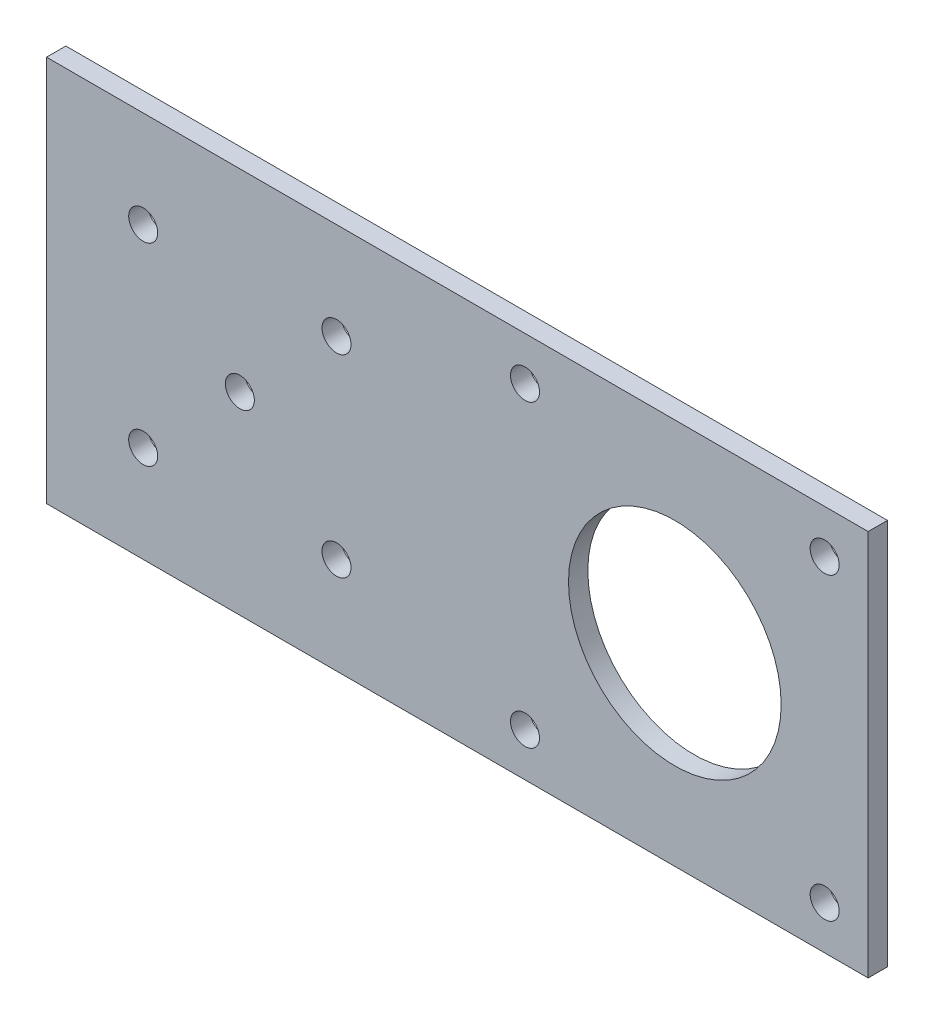
ISO-10303-21;
HEADER;
FILE_DESCRIPTION(('STEP AP214'),'2;1');
FILE_NAME('part.step','',(''),(''),'','','');
FILE_SCHEMA(('AUTOMOTIVE_DESIGN { 1 0 10303 214 1 1 1 1 }'));
ENDSEC;
DATA;
#1=APPLICATION_CONTEXT('core data for automotive mechanical design processes');
#2=APPLICATION_PROTOCOL_DEFINITION('international standard','automotive_design',2000,#1);
#3=PRODUCT_CONTEXT('',#1,'mechanical');
#4=PRODUCT('Part','Part','',(#3));
#5=PRODUCT_RELATED_PRODUCT_CATEGORY('part','',(#4));
#6=PRODUCT_DEFINITION_FORMATION('','',#4);
#7=PRODUCT_DEFINITION_CONTEXT('part definition',#1,'design');
#8=PRODUCT_DEFINITION('design','',#6,#7);
#9=PRODUCT_DEFINITION_SHAPE('','',#8);
#10=(LENGTH_UNIT() NAMED_UNIT(*) SI_UNIT(.MILLI.,.METRE.));
#11=(NAMED_UNIT(*) PLANE_ANGLE_UNIT() SI_UNIT($,.RADIAN.));
#12=(NAMED_UNIT(*) SI_UNIT($,.STERADIAN.) SOLID_ANGLE_UNIT());
#13=UNCERTAINTY_MEASURE_WITH_UNIT(LENGTH_MEASURE(1.E-05),#10,'distance_accuracy_value','');
#14=(GEOMETRIC_REPRESENTATION_CONTEXT(3) GLOBAL_UNCERTAINTY_ASSIGNED_CONTEXT((#13)) GLOBAL_UNIT_ASSIGNED_CONTEXT((#10,
#11,#12)) REPRESENTATION_CONTEXT('',''));
#15=CARTESIAN_POINT('',(0.,0.,0.));
#16=DIRECTION('',(0.,0.,1.));
#17=DIRECTION('',(1.,0.,0.));
#18=AXIS2_PLACEMENT_3D('',#15,#16,#17);
#19=CARTESIAN_POINT('',(42.5,20.,1.));
#20=DIRECTION('',(-1.,0.,0.));
#21=DIRECTION('',(0.,-1.,0.));
#22=AXIS2_PLACEMENT_3D('',#19,#20,#21);
#23=PLANE('',#22);
#24=DIRECTION('',(0.,1.,0.));
#25=VECTOR('',#24,1.);
#26=CARTESIAN_POINT('',(42.5,20.,-1.));
#27=LINE('',#26,#25);
#28=CARTESIAN_POINT('',(42.5,-20.,-1.));
#29=VERTEX_POINT('',#28);
#30=CARTESIAN_POINT('',(42.5,20.,-1.));
#31=VERTEX_POINT('',#30);
#32=EDGE_CURVE('E104',#29,#31,#27,.T.);
#33=ORIENTED_EDGE('',*,*,#32,.T.);
#34=DIRECTION('',(0.,0.,-1.));
#35=VECTOR('',#34,1.);
#36=CARTESIAN_POINT('',(42.5,20.,1.));
#37=LINE('',#36,#35);
#38=CARTESIAN_POINT('',(42.5,20.,1.));
#39=VERTEX_POINT('',#38);
#40=EDGE_CURVE('E11',#39,#31,#37,.T.);
#41=ORIENTED_EDGE('',*,*,#40,.F.);
#42=DIRECTION('',(0.,1.,0.));
#43=VECTOR('',#42,1.);
#44=CARTESIAN_POINT('',(42.5,20.,1.));
#45=LINE('',#44,#43);
#46=CARTESIAN_POINT('',(42.5,-20.,1.));
#47=VERTEX_POINT('',#46);
#48=EDGE_CURVE('E91',#47,#39,#45,.T.);
#49=ORIENTED_EDGE('',*,*,#48,.F.);
#50=DIRECTION('',(0.,0.,-1.));
#51=VECTOR('',#50,1.);
#52=CARTESIAN_POINT('',(42.5,-20.,1.));
#53=LINE('',#52,#51);
#54=EDGE_CURVE('E100',#47,#29,#53,.T.);
#55=ORIENTED_EDGE('',*,*,#54,.T.);
#56=EDGE_LOOP('',(#33,#41,#49,#55));
#57=FACE_BOUND('',#56,.T.);
#58=ADVANCED_FACE('F38',(#57),#23,.F.);
#59=CARTESIAN_POINT('',(-42.5,20.,1.));
#60=DIRECTION('',(0.,-1.,0.));
#61=DIRECTION('',(0.,0.,-1.));
#62=AXIS2_PLACEMENT_3D('',#59,#60,#61);
#63=PLANE('',#62);
#64=DIRECTION('',(-1.,0.,0.));
#65=VECTOR('',#64,1.);
#66=CARTESIAN_POINT('',(-42.5,20.,-1.));
#67=LINE('',#66,#65);
#68=CARTESIAN_POINT('',(-42.5,20.,-1.));
#69=VERTEX_POINT('',#68);
#70=EDGE_CURVE('E95',#31,#69,#67,.T.);
#71=ORIENTED_EDGE('',*,*,#70,.T.);
#72=DIRECTION('',(0.,0.,-1.));
#73=VECTOR('',#72,1.);
#74=CARTESIAN_POINT('',(-42.5,20.,1.));
#75=LINE('',#74,#73);
#76=CARTESIAN_POINT('',(-42.5,20.,1.));
#77=VERTEX_POINT('',#76);
#78=EDGE_CURVE('E47',#77,#69,#75,.T.);
#79=ORIENTED_EDGE('',*,*,#78,.F.);
#80=DIRECTION('',(-1.,0.,0.));
#81=VECTOR('',#80,1.);
#82=CARTESIAN_POINT('',(-42.5,20.,1.));
#83=LINE('',#82,#81);
#84=EDGE_CURVE('E86',#39,#77,#83,.T.);
#85=ORIENTED_EDGE('',*,*,#84,.F.);
#86=ORIENTED_EDGE('',*,*,#40,.T.);
#87=EDGE_LOOP('',(#71,#79,#85,#86));
#88=FACE_BOUND('',#87,.T.);
#89=ADVANCED_FACE('F94',(#88),#63,.F.);
#90=CARTESIAN_POINT('',(-42.5,20.,1.));
#91=DIRECTION('',(1.,0.,0.));
#92=DIRECTION('',(0.,0.,-1.));
#93=AXIS2_PLACEMENT_3D('',#90,#91,#92);
#94=PLANE('',#93);
#95=DIRECTION('',(0.,-1.,0.));
#96=VECTOR('',#95,1.);
#97=CARTESIAN_POINT('',(-42.5,20.,-1.));
#98=LINE('',#97,#96);
#99=CARTESIAN_POINT('',(-42.5,-20.,-1.));
#100=VERTEX_POINT('',#99);
#101=EDGE_CURVE('E73',#69,#100,#98,.T.);
#102=ORIENTED_EDGE('',*,*,#101,.T.);
#103=DIRECTION('',(0.,0.,-1.));
#104=VECTOR('',#103,1.);
#105=CARTESIAN_POINT('',(-42.5,-20.,1.));
#106=LINE('',#105,#104);
#107=CARTESIAN_POINT('',(-42.5,-20.,1.));
#108=VERTEX_POINT('',#107);
#109=EDGE_CURVE('E96',#108,#100,#106,.T.);
#110=ORIENTED_EDGE('',*,*,#109,.F.);
#111=DIRECTION('',(0.,-1.,0.));
#112=VECTOR('',#111,1.);
#113=CARTESIAN_POINT('',(-42.5,20.,1.));
#114=LINE('',#113,#112);
#115=EDGE_CURVE('E89',#77,#108,#114,.T.);
#116=ORIENTED_EDGE('',*,*,#115,.F.);
#117=ORIENTED_EDGE('',*,*,#78,.T.);
#118=EDGE_LOOP('',(#102,#110,#116,#117));
#119=FACE_BOUND('',#118,.T.);
#120=ADVANCED_FACE('F98',(#119),#94,.F.);
#121=CARTESIAN_POINT('',(-42.5,-20.,1.));
#122=DIRECTION('',(0.,1.,0.));
#123=DIRECTION('',(0.,0.,1.));
#124=AXIS2_PLACEMENT_3D('',#121,#122,#123);
#125=PLANE('',#124);
#126=DIRECTION('',(1.,0.,0.));
#127=VECTOR('',#126,1.);
#128=CARTESIAN_POINT('',(-42.5,-20.,-1.));
#129=LINE('',#128,#127);
#130=EDGE_CURVE('E79',#100,#29,#129,.T.);
#131=ORIENTED_EDGE('',*,*,#130,.T.);
#132=ORIENTED_EDGE('',*,*,#54,.F.);
#133=DIRECTION('',(1.,0.,0.));
#134=VECTOR('',#133,1.);
#135=CARTESIAN_POINT('',(-42.5,-20.,1.));
#136=LINE('',#135,#134);
#137=EDGE_CURVE('E56',#108,#47,#136,.T.);
#138=ORIENTED_EDGE('',*,*,#137,.F.);
#139=ORIENTED_EDGE('',*,*,#109,.T.);
#140=EDGE_LOOP('',(#131,#132,#138,#139));
#141=FACE_BOUND('',#140,.T.);
#142=ADVANCED_FACE('F167',(#141),#125,.F.);
#143=CARTESIAN_POINT('',(0.,0.,1.));
#144=DIRECTION('',(0.,0.,1.));
#145=DIRECTION('',(1.,0.,0.));
#146=AXIS2_PLACEMENT_3D('',#143,#144,#145);
#147=PLANE('',#146);
#148=CARTESIAN_POINT('',(7.00000000000032,-15.5,1.));
#149=DIRECTION('',(0.,0.,1.));
#150=DIRECTION('',(1.,0.,0.));
#151=AXIS2_PLACEMENT_3D('',#148,#149,#150);
#152=CIRCLE('',#151,1.5);
#153=CARTESIAN_POINT('',(8.50000000000033,-15.5,1.));
#154=VERTEX_POINT('',#153);
#155=EDGE_CURVE('E333',#154,#154,#152,.T.);
#156=ORIENTED_EDGE('',*,*,#155,.F.);
#157=EDGE_LOOP('',(#156));
#158=FACE_BOUND('',#157,.T.);
#159=CARTESIAN_POINT('',(38.0000000000003,-15.5,1.));
#160=DIRECTION('',(0.,0.,1.));
#161=DIRECTION('',(1.,0.,0.));
#162=AXIS2_PLACEMENT_3D('',#159,#160,#161);
#163=CIRCLE('',#162,1.5);
#164=CARTESIAN_POINT('',(39.5000000000003,-15.5,1.));
#165=VERTEX_POINT('',#164);
#166=EDGE_CURVE('E334',#165,#165,#163,.T.);
#167=ORIENTED_EDGE('',*,*,#166,.F.);
#168=EDGE_LOOP('',(#167));
#169=FACE_BOUND('',#168,.T.);
#170=CARTESIAN_POINT('',(38.,15.5,1.));
#171=DIRECTION('',(0.,0.,1.));
#172=DIRECTION('',(1.,0.,0.));
#173=AXIS2_PLACEMENT_3D('',#170,#171,#172);
#174=CIRCLE('',#173,1.5);
#175=CARTESIAN_POINT('',(39.5,15.5,1.));
#176=VERTEX_POINT('',#175);
#177=EDGE_CURVE('E337',#176,#176,#174,.T.);
#178=ORIENTED_EDGE('',*,*,#177,.F.);
#179=EDGE_LOOP('',(#178));
#180=FACE_BOUND('',#179,.T.);
#181=CARTESIAN_POINT('',(7.,15.5,1.));
#182=DIRECTION('',(0.,0.,1.));
#183=DIRECTION('',(1.,0.,0.));
#184=AXIS2_PLACEMENT_3D('',#181,#182,#183);
#185=CIRCLE('',#184,1.5);
#186=CARTESIAN_POINT('',(8.5,15.5,1.));
#187=VERTEX_POINT('',#186);
#188=EDGE_CURVE('E117',#187,#187,#185,.T.);
#189=ORIENTED_EDGE('',*,*,#188,.F.);
#190=EDGE_LOOP('',(#189));
#191=FACE_BOUND('',#190,.T.);
#192=CARTESIAN_POINT('',(22.5,0.,1.));
#193=DIRECTION('',(0.,0.,1.));
#194=DIRECTION('',(1.,0.,0.));
#195=AXIS2_PLACEMENT_3D('',#192,#193,#194);
#196=CIRCLE('',#195,11.);
#197=CARTESIAN_POINT('',(33.5,0.,1.));
#198=VERTEX_POINT('',#197);
#199=EDGE_CURVE('E140',#198,#198,#196,.T.);
#200=ORIENTED_EDGE('',*,*,#199,.F.);
#201=EDGE_LOOP('',(#200));
#202=FACE_BOUND('',#201,.T.);
#203=CARTESIAN_POINT('',(-32.4999999999998,-10.,1.));
#204=DIRECTION('',(0.,0.,1.));
#205=DIRECTION('',(1.,0.,0.));
#206=AXIS2_PLACEMENT_3D('',#203,#204,#205);
#207=CIRCLE('',#206,1.5);
#208=CARTESIAN_POINT('',(-30.9999999999998,-10.,1.));
#209=VERTEX_POINT('',#208);
#210=EDGE_CURVE('E124',#209,#209,#207,.T.);
#211=ORIENTED_EDGE('',*,*,#210,.F.);
#212=EDGE_LOOP('',(#211));
#213=FACE_BOUND('',#212,.T.);
#214=CARTESIAN_POINT('',(-12.4999999999998,-10.,1.));
#215=DIRECTION('',(0.,0.,1.));
#216=DIRECTION('',(1.,0.,0.));
#217=AXIS2_PLACEMENT_3D('',#214,#215,#216);
#218=CIRCLE('',#217,1.5);
#219=CARTESIAN_POINT('',(-10.9999999999998,-10.,1.));
#220=VERTEX_POINT('',#219);
#221=EDGE_CURVE('E133',#220,#220,#218,.T.);
#222=ORIENTED_EDGE('',*,*,#221,.F.);
#223=EDGE_LOOP('',(#222));
#224=FACE_BOUND('',#223,.T.);
#225=CARTESIAN_POINT('',(-12.5,9.99999999999999,1.));
#226=DIRECTION('',(0.,0.,1.));
#227=DIRECTION('',(1.,0.,0.));
#228=AXIS2_PLACEMENT_3D('',#225,#226,#227);
#229=CIRCLE('',#228,1.5);
#230=CARTESIAN_POINT('',(-11.,9.99999999999999,1.));
#231=VERTEX_POINT('',#230);
#232=EDGE_CURVE('E153',#231,#231,#229,.T.);
#233=ORIENTED_EDGE('',*,*,#232,.F.);
#234=EDGE_LOOP('',(#233));
#235=FACE_BOUND('',#234,.T.);
#236=CARTESIAN_POINT('',(-32.5,9.99999999999999,1.));
#237=DIRECTION('',(0.,0.,1.));
#238=DIRECTION('',(1.,0.,0.));
#239=AXIS2_PLACEMENT_3D('',#236,#237,#238);
#240=CIRCLE('',#239,1.5);
#241=CARTESIAN_POINT('',(-31.,9.99999999999999,1.));
#242=VERTEX_POINT('',#241);
#243=EDGE_CURVE('E147',#242,#242,#240,.T.);
#244=ORIENTED_EDGE('',*,*,#243,.F.);
#245=EDGE_LOOP('',(#244));
#246=FACE_BOUND('',#245,.T.);
#247=CARTESIAN_POINT('',(-22.5,0.,1.));
#248=DIRECTION('',(0.,0.,1.));
#249=DIRECTION('',(1.,0.,0.));
#250=AXIS2_PLACEMENT_3D('',#247,#248,#249);
#251=CIRCLE('',#250,1.5);
#252=CARTESIAN_POINT('',(-21.,0.,1.));
#253=VERTEX_POINT('',#252);
#254=EDGE_CURVE('E141',#253,#253,#251,.T.);
#255=ORIENTED_EDGE('',*,*,#254,.F.);
#256=EDGE_LOOP('',(#255));
#257=FACE_BOUND('',#256,.T.);
#258=ORIENTED_EDGE('',*,*,#48,.T.);
#259=ORIENTED_EDGE('',*,*,#84,.T.);
#260=ORIENTED_EDGE('',*,*,#115,.T.);
#261=ORIENTED_EDGE('',*,*,#137,.T.);
#262=EDGE_LOOP('',(#258,#259,#260,#261));
#263=FACE_BOUND('',#262,.T.);
#264=ADVANCED_FACE('F87',(#158,#169,#180,#191,#202,#213,#224,#235,#246,#257,#263),#147,.T.);
#265=CARTESIAN_POINT('',(0.,0.,-1.));
#266=DIRECTION('',(0.,0.,1.));
#267=DIRECTION('',(1.,0.,0.));
#268=AXIS2_PLACEMENT_3D('',#265,#266,#267);
#269=PLANE('',#268);
#270=CARTESIAN_POINT('',(7.00000000000032,-15.5,-1.));
#271=DIRECTION('',(0.,0.,1.));
#272=DIRECTION('',(1.,0.,0.));
#273=AXIS2_PLACEMENT_3D('',#270,#271,#272);
#274=CIRCLE('',#273,1.5);
#275=CARTESIAN_POINT('',(8.50000000000033,-15.5,-1.));
#276=VERTEX_POINT('',#275);
#277=EDGE_CURVE('E41',#276,#276,#274,.T.);
#278=ORIENTED_EDGE('',*,*,#277,.T.);
#279=EDGE_LOOP('',(#278));
#280=FACE_BOUND('',#279,.T.);
#281=CARTESIAN_POINT('',(38.0000000000003,-15.5,-1.));
#282=DIRECTION('',(0.,0.,1.));
#283=DIRECTION('',(1.,0.,0.));
#284=AXIS2_PLACEMENT_3D('',#281,#282,#283);
#285=CIRCLE('',#284,1.5);
#286=CARTESIAN_POINT('',(39.5000000000003,-15.5,-1.));
#287=VERTEX_POINT('',#286);
#288=EDGE_CURVE('E119',#287,#287,#285,.T.);
#289=ORIENTED_EDGE('',*,*,#288,.T.);
#290=EDGE_LOOP('',(#289));
#291=FACE_BOUND('',#290,.T.);
#292=CARTESIAN_POINT('',(38.,15.5,-1.));
#293=DIRECTION('',(0.,0.,1.));
#294=DIRECTION('',(1.,0.,0.));
#295=AXIS2_PLACEMENT_3D('',#292,#293,#294);
#296=CIRCLE('',#295,1.5);
#297=CARTESIAN_POINT('',(39.5,15.5,-1.));
#298=VERTEX_POINT('',#297);
#299=EDGE_CURVE('E116',#298,#298,#296,.T.);
#300=ORIENTED_EDGE('',*,*,#299,.T.);
#301=EDGE_LOOP('',(#300));
#302=FACE_BOUND('',#301,.T.);
#303=CARTESIAN_POINT('',(7.,15.5,-1.));
#304=DIRECTION('',(0.,0.,1.));
#305=DIRECTION('',(1.,0.,0.));
#306=AXIS2_PLACEMENT_3D('',#303,#304,#305);
#307=CIRCLE('',#306,1.5);
#308=CARTESIAN_POINT('',(8.5,15.5,-1.));
#309=VERTEX_POINT('',#308);
#310=EDGE_CURVE('E113',#309,#309,#307,.T.);
#311=ORIENTED_EDGE('',*,*,#310,.T.);
#312=EDGE_LOOP('',(#311));
#313=FACE_BOUND('',#312,.T.);
#314=CARTESIAN_POINT('',(22.5,0.,-1.));
#315=DIRECTION('',(0.,0.,1.));
#316=DIRECTION('',(1.,0.,0.));
#317=AXIS2_PLACEMENT_3D('',#314,#315,#316);
#318=CIRCLE('',#317,11.);
#319=CARTESIAN_POINT('',(33.5,0.,-1.));
#320=VERTEX_POINT('',#319);
#321=EDGE_CURVE('E107',#320,#320,#318,.T.);
#322=ORIENTED_EDGE('',*,*,#321,.T.);
#323=EDGE_LOOP('',(#322));
#324=FACE_BOUND('',#323,.T.);
#325=CARTESIAN_POINT('',(-32.4999999999998,-10.,-1.));
#326=DIRECTION('',(0.,0.,1.));
#327=DIRECTION('',(1.,0.,0.));
#328=AXIS2_PLACEMENT_3D('',#325,#326,#327);
#329=CIRCLE('',#328,1.5);
#330=CARTESIAN_POINT('',(-30.9999999999998,-10.,-1.));
#331=VERTEX_POINT('',#330);
#332=EDGE_CURVE('E128',#331,#331,#329,.T.);
#333=ORIENTED_EDGE('',*,*,#332,.T.);
#334=EDGE_LOOP('',(#333));
#335=FACE_BOUND('',#334,.T.);
#336=CARTESIAN_POINT('',(-12.4999999999998,-10.,-1.));
#337=DIRECTION('',(0.,0.,1.));
#338=DIRECTION('',(1.,0.,0.));
#339=AXIS2_PLACEMENT_3D('',#336,#337,#338);
#340=CIRCLE('',#339,1.5);
#341=CARTESIAN_POINT('',(-10.9999999999998,-10.,-1.));
#342=VERTEX_POINT('',#341);
#343=EDGE_CURVE('E156',#342,#342,#340,.T.);
#344=ORIENTED_EDGE('',*,*,#343,.T.);
#345=EDGE_LOOP('',(#344));
#346=FACE_BOUND('',#345,.T.);
#347=CARTESIAN_POINT('',(-12.5,9.99999999999999,-1.));
#348=DIRECTION('',(0.,0.,1.));
#349=DIRECTION('',(1.,0.,0.));
#350=AXIS2_PLACEMENT_3D('',#347,#348,#349);
#351=CIRCLE('',#350,1.5);
#352=CARTESIAN_POINT('',(-11.,9.99999999999999,-1.));
#353=VERTEX_POINT('',#352);
#354=EDGE_CURVE('E150',#353,#353,#351,.T.);
#355=ORIENTED_EDGE('',*,*,#354,.T.);
#356=EDGE_LOOP('',(#355));
#357=FACE_BOUND('',#356,.T.);
#358=CARTESIAN_POINT('',(-32.5,9.99999999999999,-1.));
#359=DIRECTION('',(0.,0.,1.));
#360=DIRECTION('',(1.,0.,0.));
#361=AXIS2_PLACEMENT_3D('',#358,#359,#360);
#362=CIRCLE('',#361,1.5);
#363=CARTESIAN_POINT('',(-31.,9.99999999999999,-1.));
#364=VERTEX_POINT('',#363);
#365=EDGE_CURVE('E144',#364,#364,#362,.T.);
#366=ORIENTED_EDGE('',*,*,#365,.T.);
#367=EDGE_LOOP('',(#366));
#368=FACE_BOUND('',#367,.T.);
#369=CARTESIAN_POINT('',(-22.5,0.,-1.));
#370=DIRECTION('',(0.,0.,1.));
#371=DIRECTION('',(1.,0.,0.));
#372=AXIS2_PLACEMENT_3D('',#369,#370,#371);
#373=CIRCLE('',#372,1.5);
#374=CARTESIAN_POINT('',(-21.,0.,-1.));
#375=VERTEX_POINT('',#374);
#376=EDGE_CURVE('E137',#375,#375,#373,.T.);
#377=ORIENTED_EDGE('',*,*,#376,.T.);
#378=EDGE_LOOP('',(#377));
#379=FACE_BOUND('',#378,.T.);
#380=ORIENTED_EDGE('',*,*,#32,.F.);
#381=ORIENTED_EDGE('',*,*,#130,.F.);
#382=ORIENTED_EDGE('',*,*,#101,.F.);
#383=ORIENTED_EDGE('',*,*,#70,.F.);
#384=EDGE_LOOP('',(#380,#381,#382,#383));
#385=FACE_BOUND('',#384,.T.);
#386=ADVANCED_FACE('F166',(#280,#291,#302,#313,#324,#335,#346,#357,#368,#379,#385),#269,.F.);
#387=CARTESIAN_POINT('',(-22.5,0.,-1.));
#388=DIRECTION('',(0.,0.,1.));
#389=DIRECTION('',(1.,0.,0.));
#390=AXIS2_PLACEMENT_3D('',#387,#388,#389);
#391=CYLINDRICAL_SURFACE('',#390,1.5);
#392=ORIENTED_EDGE('',*,*,#376,.F.);
#393=EDGE_LOOP('',(#392));
#394=FACE_BOUND('',#393,.T.);
#395=ORIENTED_EDGE('',*,*,#254,.T.);
#396=EDGE_LOOP('',(#395));
#397=FACE_BOUND('',#396,.T.);
#398=ADVANCED_FACE('F176',(#394,#397),#391,.F.);
#399=CARTESIAN_POINT('',(-32.5,9.99999999999999,-1.));
#400=DIRECTION('',(0.,0.,1.));
#401=DIRECTION('',(1.,0.,0.));
#402=AXIS2_PLACEMENT_3D('',#399,#400,#401);
#403=CYLINDRICAL_SURFACE('',#402,1.5);
#404=ORIENTED_EDGE('',*,*,#365,.F.);
#405=EDGE_LOOP('',(#404));
#406=FACE_BOUND('',#405,.T.);
#407=ORIENTED_EDGE('',*,*,#243,.T.);
#408=EDGE_LOOP('',(#407));
#409=FACE_BOUND('',#408,.T.);
#410=ADVANCED_FACE('F178',(#406,#409),#403,.F.);
#411=CARTESIAN_POINT('',(-12.5,9.99999999999999,-1.));
#412=DIRECTION('',(0.,0.,1.));
#413=DIRECTION('',(1.,0.,0.));
#414=AXIS2_PLACEMENT_3D('',#411,#412,#413);
#415=CYLINDRICAL_SURFACE('',#414,1.5);
#416=ORIENTED_EDGE('',*,*,#354,.F.);
#417=EDGE_LOOP('',(#416));
#418=FACE_BOUND('',#417,.T.);
#419=ORIENTED_EDGE('',*,*,#232,.T.);
#420=EDGE_LOOP('',(#419));
#421=FACE_BOUND('',#420,.T.);
#422=ADVANCED_FACE('F185',(#418,#421),#415,.F.);
#423=CARTESIAN_POINT('',(-12.4999999999998,-10.,-1.));
#424=DIRECTION('',(0.,0.,1.));
#425=DIRECTION('',(1.,0.,0.));
#426=AXIS2_PLACEMENT_3D('',#423,#424,#425);
#427=CYLINDRICAL_SURFACE('',#426,1.5);
#428=ORIENTED_EDGE('',*,*,#343,.F.);
#429=EDGE_LOOP('',(#428));
#430=FACE_BOUND('',#429,.T.);
#431=ORIENTED_EDGE('',*,*,#221,.T.);
#432=EDGE_LOOP('',(#431));
#433=FACE_BOUND('',#432,.T.);
#434=ADVANCED_FACE('F162',(#430,#433),#427,.F.);
#435=CARTESIAN_POINT('',(-32.4999999999998,-10.,-1.));
#436=DIRECTION('',(0.,0.,1.));
#437=DIRECTION('',(1.,0.,0.));
#438=AXIS2_PLACEMENT_3D('',#435,#436,#437);
#439=CYLINDRICAL_SURFACE('',#438,1.5);
#440=ORIENTED_EDGE('',*,*,#332,.F.);
#441=EDGE_LOOP('',(#440));
#442=FACE_BOUND('',#441,.T.);
#443=ORIENTED_EDGE('',*,*,#210,.T.);
#444=EDGE_LOOP('',(#443));
#445=FACE_BOUND('',#444,.T.);
#446=ADVANCED_FACE('F207',(#442,#445),#439,.F.);
#447=CARTESIAN_POINT('',(22.5,0.,-1.));
#448=DIRECTION('',(0.,0.,1.));
#449=DIRECTION('',(1.,0.,0.));
#450=AXIS2_PLACEMENT_3D('',#447,#448,#449);
#451=CYLINDRICAL_SURFACE('',#450,11.);
#452=ORIENTED_EDGE('',*,*,#321,.F.);
#453=EDGE_LOOP('',(#452));
#454=FACE_BOUND('',#453,.T.);
#455=ORIENTED_EDGE('',*,*,#199,.T.);
#456=EDGE_LOOP('',(#455));
#457=FACE_BOUND('',#456,.T.);
#458=ADVANCED_FACE('F232',(#454,#457),#451,.F.);
#459=CARTESIAN_POINT('',(7.,15.5,-9.));
#460=DIRECTION('',(0.,0.,1.));
#461=DIRECTION('',(1.,0.,0.));
#462=AXIS2_PLACEMENT_3D('',#459,#460,#461);
#463=CYLINDRICAL_SURFACE('',#462,1.5);
#464=ORIENTED_EDGE('',*,*,#188,.T.);
#465=EDGE_LOOP('',(#464));
#466=FACE_BOUND('',#465,.T.);
#467=ORIENTED_EDGE('',*,*,#310,.F.);
#468=EDGE_LOOP('',(#467));
#469=FACE_BOUND('',#468,.T.);
#470=ADVANCED_FACE('F239',(#466,#469),#463,.F.);
#471=CARTESIAN_POINT('',(38.,15.5,-9.));
#472=DIRECTION('',(0.,0.,1.));
#473=DIRECTION('',(1.,0.,0.));
#474=AXIS2_PLACEMENT_3D('',#471,#472,#473);
#475=CYLINDRICAL_SURFACE('',#474,1.5);
#476=ORIENTED_EDGE('',*,*,#177,.T.);
#477=EDGE_LOOP('',(#476));
#478=FACE_BOUND('',#477,.T.);
#479=ORIENTED_EDGE('',*,*,#299,.F.);
#480=EDGE_LOOP('',(#479));
#481=FACE_BOUND('',#480,.T.);
#482=ADVANCED_FACE('F248',(#478,#481),#475,.F.);
#483=CARTESIAN_POINT('',(38.0000000000003,-15.5,-9.));
#484=DIRECTION('',(0.,0.,1.));
#485=DIRECTION('',(1.,0.,0.));
#486=AXIS2_PLACEMENT_3D('',#483,#484,#485);
#487=CYLINDRICAL_SURFACE('',#486,1.5);
#488=ORIENTED_EDGE('',*,*,#166,.T.);
#489=EDGE_LOOP('',(#488));
#490=FACE_BOUND('',#489,.T.);
#491=ORIENTED_EDGE('',*,*,#288,.F.);
#492=EDGE_LOOP('',(#491));
#493=FACE_BOUND('',#492,.T.);
#494=ADVANCED_FACE('F257',(#490,#493),#487,.F.);
#495=CARTESIAN_POINT('',(7.00000000000032,-15.5,-9.));
#496=DIRECTION('',(0.,0.,1.));
#497=DIRECTION('',(1.,0.,0.));
#498=AXIS2_PLACEMENT_3D('',#495,#496,#497);
#499=CYLINDRICAL_SURFACE('',#498,1.5);
#500=ORIENTED_EDGE('',*,*,#155,.T.);
#501=EDGE_LOOP('',(#500));
#502=FACE_BOUND('',#501,.T.);
#503=ORIENTED_EDGE('',*,*,#277,.F.);
#504=EDGE_LOOP('',(#503));
#505=FACE_BOUND('',#504,.T.);
#506=ADVANCED_FACE('F265',(#502,#505),#499,.F.);
#507=CLOSED_SHELL('',(#58,#89,#120,#142,#264,#386,#398,#410,#422,#434,#446,#458,#470,#482,#494,#506));
#508=MANIFOLD_SOLID_BREP('B2',#507);
#509=ADVANCED_BREP_SHAPE_REPRESENTATION('',(#18,#508),#14);
#510=SHAPE_DEFINITION_REPRESENTATION(#9,#509);
ENDSEC;
END-ISO-10303-21;
